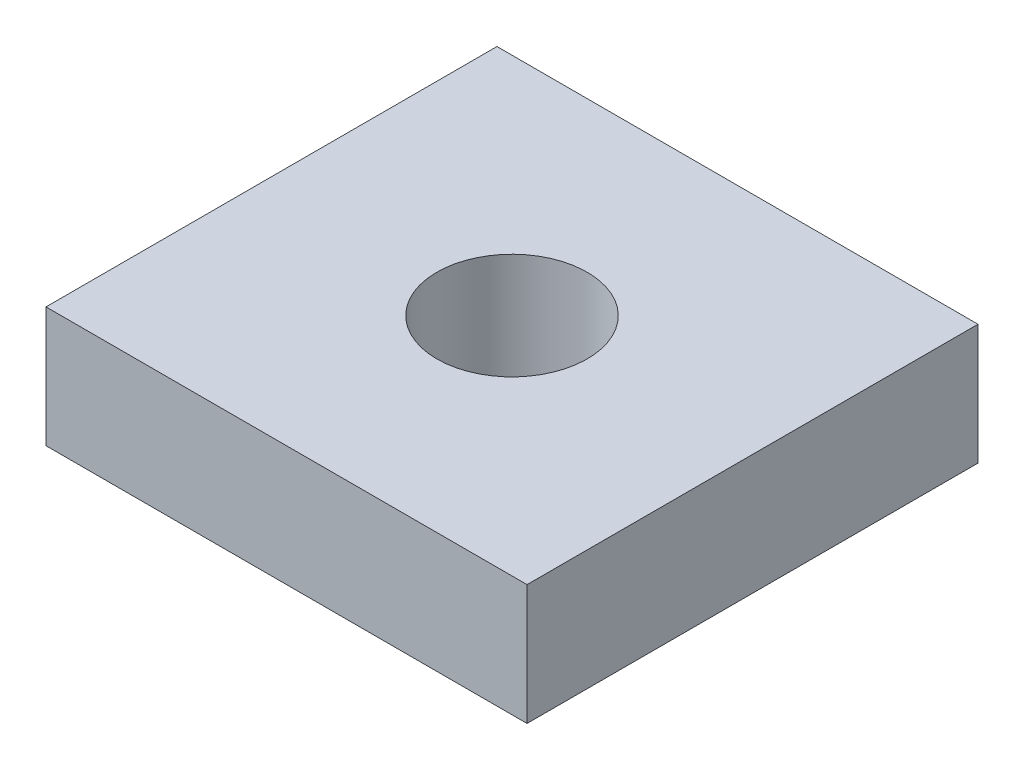
ISO-10303-21;
HEADER;
FILE_DESCRIPTION(('STEP AP214'),'2;1');
FILE_NAME('part.step','',(''),(''),'','','');
FILE_SCHEMA(('AUTOMOTIVE_DESIGN { 1 0 10303 214 1 1 1 1 }'));
ENDSEC;
DATA;
#1=APPLICATION_CONTEXT('core data for automotive mechanical design processes');
#2=APPLICATION_PROTOCOL_DEFINITION('international standard','automotive_design',2000,#1);
#3=PRODUCT_CONTEXT('',#1,'mechanical');
#4=PRODUCT('Part','Part','',(#3));
#5=PRODUCT_RELATED_PRODUCT_CATEGORY('part','',(#4));
#6=PRODUCT_DEFINITION_FORMATION('','',#4);
#7=PRODUCT_DEFINITION_CONTEXT('part definition',#1,'design');
#8=PRODUCT_DEFINITION('design','',#6,#7);
#9=PRODUCT_DEFINITION_SHAPE('','',#8);
#10=(LENGTH_UNIT() NAMED_UNIT(*) SI_UNIT(.MILLI.,.METRE.));
#11=(NAMED_UNIT(*) PLANE_ANGLE_UNIT() SI_UNIT($,.RADIAN.));
#12=(NAMED_UNIT(*) SI_UNIT($,.STERADIAN.) SOLID_ANGLE_UNIT());
#13=UNCERTAINTY_MEASURE_WITH_UNIT(LENGTH_MEASURE(1.E-05),#10,'distance_accuracy_value','');
#14=(GEOMETRIC_REPRESENTATION_CONTEXT(3) GLOBAL_UNCERTAINTY_ASSIGNED_CONTEXT((#13)) GLOBAL_UNIT_ASSIGNED_CONTEXT((#10,
#11,#12)) REPRESENTATION_CONTEXT('',''));
#15=CARTESIAN_POINT('',(0.,0.,0.));
#16=DIRECTION('',(0.,0.,1.));
#17=DIRECTION('',(1.,0.,0.));
#18=AXIS2_PLACEMENT_3D('',#15,#16,#17);
#19=CARTESIAN_POINT('',(0.,4.,0.));
#20=DIRECTION('',(0.,-1.,0.));
#21=DIRECTION('',(0.,0.,-1.));
#22=AXIS2_PLACEMENT_3D('',#19,#20,#21);
#23=PLANE('',#22);
#24=DIRECTION('',(0.,0.,-1.));
#25=VECTOR('',#24,1.);
#26=CARTESIAN_POINT('',(8.,4.,7.5));
#27=LINE('',#26,#25);
#28=CARTESIAN_POINT('',(8.,4.,7.5));
#29=VERTEX_POINT('',#28);
#30=CARTESIAN_POINT('',(8.,4.,-7.5));
#31=VERTEX_POINT('',#30);
#32=EDGE_CURVE('E86',#29,#31,#27,.T.);
#33=ORIENTED_EDGE('',*,*,#32,.T.);
#34=DIRECTION('',(-1.,0.,0.));
#35=VECTOR('',#34,1.);
#36=CARTESIAN_POINT('',(-8.,4.,-7.5));
#37=LINE('',#36,#35);
#38=CARTESIAN_POINT('',(-8.,4.,-7.5));
#39=VERTEX_POINT('',#38);
#40=EDGE_CURVE('E81',#31,#39,#37,.T.);
#41=ORIENTED_EDGE('',*,*,#40,.T.);
#42=DIRECTION('',(0.,0.,1.));
#43=VECTOR('',#42,1.);
#44=CARTESIAN_POINT('',(-8.,4.,-7.5));
#45=LINE('',#44,#43);
#46=CARTESIAN_POINT('',(-8.,4.,7.5));
#47=VERTEX_POINT('',#46);
#48=EDGE_CURVE('E84',#39,#47,#45,.T.);
#49=ORIENTED_EDGE('',*,*,#48,.T.);
#50=DIRECTION('',(1.,0.,0.));
#51=VECTOR('',#50,1.);
#52=CARTESIAN_POINT('',(-8.,4.,7.5));
#53=LINE('',#52,#51);
#54=EDGE_CURVE('E51',#47,#29,#53,.T.);
#55=ORIENTED_EDGE('',*,*,#54,.T.);
#56=EDGE_LOOP('',(#33,#41,#49,#55));
#57=FACE_BOUND('',#56,.T.);
#58=CARTESIAN_POINT('',(0.,4.,0.));
#59=DIRECTION('',(0.,1.,0.));
#60=DIRECTION('',(0.,0.,1.));
#61=AXIS2_PLACEMENT_3D('',#58,#59,#60);
#62=CIRCLE('',#61,2.5);
#63=CARTESIAN_POINT('',(0.,4.,2.5));
#64=VERTEX_POINT('',#63);
#65=EDGE_CURVE('E101',#64,#64,#62,.T.);
#66=ORIENTED_EDGE('',*,*,#65,.F.);
#67=EDGE_LOOP('',(#66));
#68=FACE_BOUND('',#67,.T.);
#69=ADVANCED_FACE('F34',(#57,#68),#23,.F.);
#70=CARTESIAN_POINT('',(0.,0.,0.));
#71=DIRECTION('',(0.,-1.,0.));
#72=DIRECTION('',(0.,0.,-1.));
#73=AXIS2_PLACEMENT_3D('',#70,#71,#72);
#74=PLANE('',#73);
#75=DIRECTION('',(0.,0.,-1.));
#76=VECTOR('',#75,1.);
#77=CARTESIAN_POINT('',(8.,0.,7.5));
#78=LINE('',#77,#76);
#79=CARTESIAN_POINT('',(8.,0.,7.5));
#80=VERTEX_POINT('',#79);
#81=CARTESIAN_POINT('',(8.,0.,-7.5));
#82=VERTEX_POINT('',#81);
#83=EDGE_CURVE('E98',#80,#82,#78,.T.);
#84=ORIENTED_EDGE('',*,*,#83,.F.);
#85=DIRECTION('',(1.,0.,0.));
#86=VECTOR('',#85,1.);
#87=CARTESIAN_POINT('',(-8.,0.,7.5));
#88=LINE('',#87,#86);
#89=CARTESIAN_POINT('',(-8.,0.,7.5));
#90=VERTEX_POINT('',#89);
#91=EDGE_CURVE('E74',#90,#80,#88,.T.);
#92=ORIENTED_EDGE('',*,*,#91,.F.);
#93=DIRECTION('',(0.,0.,1.));
#94=VECTOR('',#93,1.);
#95=CARTESIAN_POINT('',(-8.,0.,-7.5));
#96=LINE('',#95,#94);
#97=CARTESIAN_POINT('',(-8.,0.,-7.5));
#98=VERTEX_POINT('',#97);
#99=EDGE_CURVE('E68',#98,#90,#96,.T.);
#100=ORIENTED_EDGE('',*,*,#99,.F.);
#101=DIRECTION('',(-1.,0.,0.));
#102=VECTOR('',#101,1.);
#103=CARTESIAN_POINT('',(-8.,0.,-7.5));
#104=LINE('',#103,#102);
#105=EDGE_CURVE('E90',#82,#98,#104,.T.);
#106=ORIENTED_EDGE('',*,*,#105,.F.);
#107=EDGE_LOOP('',(#84,#92,#100,#106));
#108=FACE_BOUND('',#107,.T.);
#109=CARTESIAN_POINT('',(0.,0.,0.));
#110=DIRECTION('',(0.,1.,0.));
#111=DIRECTION('',(0.,0.,1.));
#112=AXIS2_PLACEMENT_3D('',#109,#110,#111);
#113=CIRCLE('',#112,2.5);
#114=CARTESIAN_POINT('',(0.,0.,2.5));
#115=VERTEX_POINT('',#114);
#116=EDGE_CURVE('E113',#115,#115,#113,.T.);
#117=ORIENTED_EDGE('',*,*,#116,.T.);
#118=EDGE_LOOP('',(#117));
#119=FACE_BOUND('',#118,.T.);
#120=ADVANCED_FACE('F109',(#108,#119),#74,.T.);
#121=CARTESIAN_POINT('',(8.,4.,7.5));
#122=DIRECTION('',(-1.,0.,0.));
#123=DIRECTION('',(0.,0.,1.));
#124=AXIS2_PLACEMENT_3D('',#121,#122,#123);
#125=PLANE('',#124);
#126=ORIENTED_EDGE('',*,*,#83,.T.);
#127=DIRECTION('',(0.,-1.,0.));
#128=VECTOR('',#127,1.);
#129=CARTESIAN_POINT('',(8.,4.,-7.5));
#130=LINE('',#129,#128);
#131=EDGE_CURVE('E11',#31,#82,#130,.T.);
#132=ORIENTED_EDGE('',*,*,#131,.F.);
#133=ORIENTED_EDGE('',*,*,#32,.F.);
#134=DIRECTION('',(0.,-1.,0.));
#135=VECTOR('',#134,1.);
#136=CARTESIAN_POINT('',(8.,4.,7.5));
#137=LINE('',#136,#135);
#138=EDGE_CURVE('E94',#29,#80,#137,.T.);
#139=ORIENTED_EDGE('',*,*,#138,.T.);
#140=EDGE_LOOP('',(#126,#132,#133,#139));
#141=FACE_BOUND('',#140,.T.);
#142=ADVANCED_FACE('F36',(#141),#125,.F.);
#143=CARTESIAN_POINT('',(-8.,4.,-7.5));
#144=DIRECTION('',(0.,0.,1.));
#145=DIRECTION('',(1.,0.,0.));
#146=AXIS2_PLACEMENT_3D('',#143,#144,#145);
#147=PLANE('',#146);
#148=ORIENTED_EDGE('',*,*,#105,.T.);
#149=DIRECTION('',(0.,-1.,0.));
#150=VECTOR('',#149,1.);
#151=CARTESIAN_POINT('',(-8.,4.,-7.5));
#152=LINE('',#151,#150);
#153=EDGE_CURVE('E43',#39,#98,#152,.T.);
#154=ORIENTED_EDGE('',*,*,#153,.F.);
#155=ORIENTED_EDGE('',*,*,#40,.F.);
#156=ORIENTED_EDGE('',*,*,#131,.T.);
#157=EDGE_LOOP('',(#148,#154,#155,#156));
#158=FACE_BOUND('',#157,.T.);
#159=ADVANCED_FACE('F89',(#158),#147,.F.);
#160=CARTESIAN_POINT('',(-8.,4.,-7.5));
#161=DIRECTION('',(1.,0.,0.));
#162=DIRECTION('',(0.,0.,-1.));
#163=AXIS2_PLACEMENT_3D('',#160,#161,#162);
#164=PLANE('',#163);
#165=ORIENTED_EDGE('',*,*,#99,.T.);
#166=DIRECTION('',(0.,-1.,0.));
#167=VECTOR('',#166,1.);
#168=CARTESIAN_POINT('',(-8.,4.,7.5));
#169=LINE('',#168,#167);
#170=EDGE_CURVE('E91',#47,#90,#169,.T.);
#171=ORIENTED_EDGE('',*,*,#170,.F.);
#172=ORIENTED_EDGE('',*,*,#48,.F.);
#173=ORIENTED_EDGE('',*,*,#153,.T.);
#174=EDGE_LOOP('',(#165,#171,#172,#173));
#175=FACE_BOUND('',#174,.T.);
#176=ADVANCED_FACE('F92',(#175),#164,.F.);
#177=CARTESIAN_POINT('',(-8.,4.,7.5));
#178=DIRECTION('',(0.,0.,-1.));
#179=DIRECTION('',(-1.,0.,0.));
#180=AXIS2_PLACEMENT_3D('',#177,#178,#179);
#181=PLANE('',#180);
#182=ORIENTED_EDGE('',*,*,#91,.T.);
#183=ORIENTED_EDGE('',*,*,#138,.F.);
#184=ORIENTED_EDGE('',*,*,#54,.F.);
#185=ORIENTED_EDGE('',*,*,#170,.T.);
#186=EDGE_LOOP('',(#182,#183,#184,#185));
#187=FACE_BOUND('',#186,.T.);
#188=ADVANCED_FACE('F106',(#187),#181,.F.);
#189=CARTESIAN_POINT('',(0.,4.,0.));
#190=DIRECTION('',(0.,-1.,0.));
#191=DIRECTION('',(0.,0.,-1.));
#192=AXIS2_PLACEMENT_3D('',#189,#190,#191);
#193=CYLINDRICAL_SURFACE('',#192,2.5);
#194=ORIENTED_EDGE('',*,*,#65,.T.);
#195=EDGE_LOOP('',(#194));
#196=FACE_BOUND('',#195,.T.);
#197=ORIENTED_EDGE('',*,*,#116,.F.);
#198=EDGE_LOOP('',(#197));
#199=FACE_BOUND('',#198,.T.);
#200=ADVANCED_FACE('F119',(#196,#199),#193,.F.);
#201=CLOSED_SHELL('',(#69,#120,#142,#159,#176,#188,#200));
#202=MANIFOLD_SOLID_BREP('B2',#201);
#203=ADVANCED_BREP_SHAPE_REPRESENTATION('',(#18,#202),#14);
#204=SHAPE_DEFINITION_REPRESENTATION(#9,#203);
ENDSEC;
END-ISO-10303-21;
